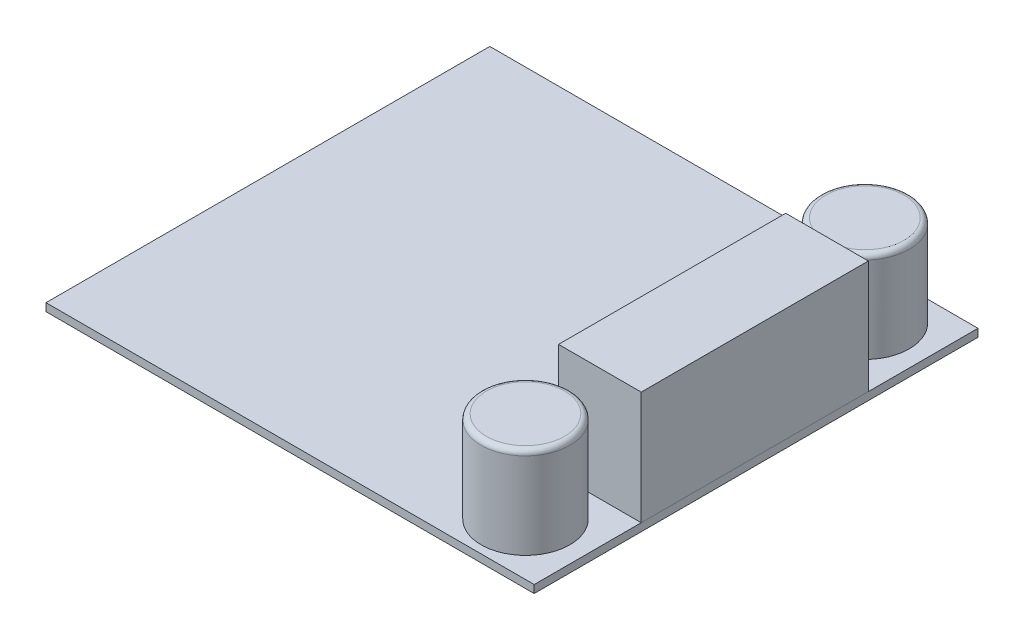
ISO-10303-21;
HEADER;
FILE_DESCRIPTION(('STEP AP214'),'2;1');
FILE_NAME('part.step','',(''),(''),'','','');
FILE_SCHEMA(('AUTOMOTIVE_DESIGN { 1 0 10303 214 1 1 1 1 }'));
ENDSEC;
DATA;
#1=APPLICATION_CONTEXT('core data for automotive mechanical design processes');
#2=APPLICATION_PROTOCOL_DEFINITION('international standard','automotive_design',2000,#1);
#3=PRODUCT_CONTEXT('',#1,'mechanical');
#4=PRODUCT('Part','Part','',(#3));
#5=PRODUCT_RELATED_PRODUCT_CATEGORY('part','',(#4));
#6=PRODUCT_DEFINITION_FORMATION('','',#4);
#7=PRODUCT_DEFINITION_CONTEXT('part definition',#1,'design');
#8=PRODUCT_DEFINITION('design','',#6,#7);
#9=PRODUCT_DEFINITION_SHAPE('','',#8);
#10=(LENGTH_UNIT() NAMED_UNIT(*) SI_UNIT(.MILLI.,.METRE.));
#11=(NAMED_UNIT(*) PLANE_ANGLE_UNIT() SI_UNIT($,.RADIAN.));
#12=(NAMED_UNIT(*) SI_UNIT($,.STERADIAN.) SOLID_ANGLE_UNIT());
#13=UNCERTAINTY_MEASURE_WITH_UNIT(LENGTH_MEASURE(1.E-05),#10,'distance_accuracy_value','');
#14=(GEOMETRIC_REPRESENTATION_CONTEXT(3) GLOBAL_UNCERTAINTY_ASSIGNED_CONTEXT((#13)) GLOBAL_UNIT_ASSIGNED_CONTEXT((#10,
#11,#12)) REPRESENTATION_CONTEXT('',''));
#15=CARTESIAN_POINT('',(0.,0.,0.));
#16=DIRECTION('',(0.,0.,1.));
#17=DIRECTION('',(1.,0.,0.));
#18=AXIS2_PLACEMENT_3D('',#15,#16,#17);
#19=CARTESIAN_POINT('',(18.55,13.9,-12.9));
#20=DIRECTION('',(1.,0.,0.));
#21=DIRECTION('',(0.,0.,-1.));
#22=AXIS2_PLACEMENT_3D('',#19,#20,#21);
#23=PLANE('',#22);
#24=DIRECTION('',(0.,0.,1.));
#25=VECTOR('',#24,1.);
#26=CARTESIAN_POINT('',(18.55,0.9,-12.9));
#27=LINE('',#26,#25);
#28=CARTESIAN_POINT('',(18.55,0.9,-12.9));
#29=VERTEX_POINT('',#28);
#30=CARTESIAN_POINT('',(18.55,0.9,13.2));
#31=VERTEX_POINT('',#30);
#32=EDGE_CURVE('E105',#29,#31,#27,.T.);
#33=ORIENTED_EDGE('',*,*,#32,.T.);
#34=DIRECTION('',(0.,-1.,0.));
#35=VECTOR('',#34,1.);
#36=CARTESIAN_POINT('',(18.55,13.9,13.2));
#37=LINE('',#36,#35);
#38=CARTESIAN_POINT('',(18.55,13.9,13.2));
#39=VERTEX_POINT('',#38);
#40=EDGE_CURVE('E12',#39,#31,#37,.T.);
#41=ORIENTED_EDGE('',*,*,#40,.F.);
#42=DIRECTION('',(0.,0.,1.));
#43=VECTOR('',#42,1.);
#44=CARTESIAN_POINT('',(18.55,13.9,-12.9));
#45=LINE('',#44,#43);
#46=CARTESIAN_POINT('',(18.55,13.9,-12.9));
#47=VERTEX_POINT('',#46);
#48=EDGE_CURVE('E93',#47,#39,#45,.T.);
#49=ORIENTED_EDGE('',*,*,#48,.F.);
#50=DIRECTION('',(0.,-1.,0.));
#51=VECTOR('',#50,1.);
#52=CARTESIAN_POINT('',(18.55,13.9,-12.9));
#53=LINE('',#52,#51);
#54=EDGE_CURVE('E101',#47,#29,#53,.T.);
#55=ORIENTED_EDGE('',*,*,#54,.T.);
#56=EDGE_LOOP('',(#33,#41,#49,#55));
#57=FACE_BOUND('',#56,.T.);
#58=ADVANCED_FACE('F42',(#57),#23,.F.);
#59=CARTESIAN_POINT('',(18.55,13.9,13.2));
#60=DIRECTION('',(0.,0.,-1.));
#61=DIRECTION('',(-1.,0.,0.));
#62=AXIS2_PLACEMENT_3D('',#59,#60,#61);
#63=PLANE('',#62);
#64=DIRECTION('',(1.,0.,0.));
#65=VECTOR('',#64,1.);
#66=CARTESIAN_POINT('',(18.55,0.9,13.2));
#67=LINE('',#66,#65);
#68=CARTESIAN_POINT('',(28.05,0.9,13.2));
#69=VERTEX_POINT('',#68);
#70=EDGE_CURVE('E97',#31,#69,#67,.T.);
#71=ORIENTED_EDGE('',*,*,#70,.T.);
#72=DIRECTION('',(0.,-1.,0.));
#73=VECTOR('',#72,1.);
#74=CARTESIAN_POINT('',(28.05,13.9,13.2));
#75=LINE('',#74,#73);
#76=CARTESIAN_POINT('',(28.05,13.9,13.2));
#77=VERTEX_POINT('',#76);
#78=EDGE_CURVE('E50',#77,#69,#75,.T.);
#79=ORIENTED_EDGE('',*,*,#78,.F.);
#80=DIRECTION('',(1.,0.,0.));
#81=VECTOR('',#80,1.);
#82=CARTESIAN_POINT('',(18.55,13.9,13.2));
#83=LINE('',#82,#81);
#84=EDGE_CURVE('E88',#39,#77,#83,.T.);
#85=ORIENTED_EDGE('',*,*,#84,.F.);
#86=ORIENTED_EDGE('',*,*,#40,.T.);
#87=EDGE_LOOP('',(#71,#79,#85,#86));
#88=FACE_BOUND('',#87,.T.);
#89=ADVANCED_FACE('F96',(#88),#63,.F.);
#90=CARTESIAN_POINT('',(28.05,13.9,-12.9));
#91=DIRECTION('',(-1.,0.,0.));
#92=DIRECTION('',(0.,0.,1.));
#93=AXIS2_PLACEMENT_3D('',#90,#91,#92);
#94=PLANE('',#93);
#95=DIRECTION('',(0.,0.,-1.));
#96=VECTOR('',#95,1.);
#97=CARTESIAN_POINT('',(28.05,0.9,-12.9));
#98=LINE('',#97,#96);
#99=CARTESIAN_POINT('',(28.05,0.9,-12.9));
#100=VERTEX_POINT('',#99);
#101=EDGE_CURVE('E75',#69,#100,#98,.T.);
#102=ORIENTED_EDGE('',*,*,#101,.T.);
#103=DIRECTION('',(0.,-1.,0.));
#104=VECTOR('',#103,1.);
#105=CARTESIAN_POINT('',(28.05,13.9,-12.9));
#106=LINE('',#105,#104);
#107=CARTESIAN_POINT('',(28.05,13.9,-12.9));
#108=VERTEX_POINT('',#107);
#109=EDGE_CURVE('E98',#108,#100,#106,.T.);
#110=ORIENTED_EDGE('',*,*,#109,.F.);
#111=DIRECTION('',(0.,0.,-1.));
#112=VECTOR('',#111,1.);
#113=CARTESIAN_POINT('',(28.05,13.9,-12.9));
#114=LINE('',#113,#112);
#115=EDGE_CURVE('E91',#77,#108,#114,.T.);
#116=ORIENTED_EDGE('',*,*,#115,.F.);
#117=ORIENTED_EDGE('',*,*,#78,.T.);
#118=EDGE_LOOP('',(#102,#110,#116,#117));
#119=FACE_BOUND('',#118,.T.);
#120=ADVANCED_FACE('F99',(#119),#94,.F.);
#121=CARTESIAN_POINT('',(18.55,13.9,-12.9));
#122=DIRECTION('',(0.,0.,1.));
#123=DIRECTION('',(1.,0.,0.));
#124=AXIS2_PLACEMENT_3D('',#121,#122,#123);
#125=PLANE('',#124);
#126=DIRECTION('',(-1.,0.,0.));
#127=VECTOR('',#126,1.);
#128=CARTESIAN_POINT('',(18.55,0.9,-12.9));
#129=LINE('',#128,#127);
#130=EDGE_CURVE('E81',#100,#29,#129,.T.);
#131=ORIENTED_EDGE('',*,*,#130,.T.);
#132=ORIENTED_EDGE('',*,*,#54,.F.);
#133=DIRECTION('',(-1.,0.,0.));
#134=VECTOR('',#133,1.);
#135=CARTESIAN_POINT('',(18.55,13.9,-12.9));
#136=LINE('',#135,#134);
#137=EDGE_CURVE('E58',#108,#47,#136,.T.);
#138=ORIENTED_EDGE('',*,*,#137,.F.);
#139=ORIENTED_EDGE('',*,*,#109,.T.);
#140=EDGE_LOOP('',(#131,#132,#138,#139));
#141=FACE_BOUND('',#140,.T.);
#142=ADVANCED_FACE('F112',(#141),#125,.F.);
#143=CARTESIAN_POINT('',(0.,13.9,0.));
#144=DIRECTION('',(0.,1.,0.));
#145=DIRECTION('',(0.,0.,1.));
#146=AXIS2_PLACEMENT_3D('',#143,#144,#145);
#147=PLANE('',#146);
#148=ORIENTED_EDGE('',*,*,#48,.T.);
#149=ORIENTED_EDGE('',*,*,#84,.T.);
#150=ORIENTED_EDGE('',*,*,#115,.T.);
#151=ORIENTED_EDGE('',*,*,#137,.T.);
#152=EDGE_LOOP('',(#148,#149,#150,#151));
#153=FACE_BOUND('',#152,.T.);
#154=ADVANCED_FACE('F89',(#153),#147,.T.);
#155=CARTESIAN_POINT('',(0.,0.9,0.));
#156=DIRECTION('',(0.,1.,0.));
#157=DIRECTION('',(0.,0.,1.));
#158=AXIS2_PLACEMENT_3D('',#155,#156,#157);
#159=PLANE('',#158);
#160=ORIENTED_EDGE('',*,*,#32,.F.);
#161=ORIENTED_EDGE('',*,*,#130,.F.);
#162=ORIENTED_EDGE('',*,*,#101,.F.);
#163=ORIENTED_EDGE('',*,*,#70,.F.);
#164=EDGE_LOOP('',(#160,#161,#162,#163));
#165=FACE_BOUND('',#164,.T.);
#166=ADVANCED_FACE('F115',(#165),#159,.F.);
#167=CLOSED_SHELL('',(#58,#89,#120,#142,#154,#166));
#168=MANIFOLD_SOLID_BREP('B2',#167);
#169=CARTESIAN_POINT('',(0.,0.9,0.));
#170=DIRECTION('',(0.,-1.,0.));
#171=DIRECTION('',(0.,0.,-1.));
#172=AXIS2_PLACEMENT_3D('',#169,#170,#171);
#173=PLANE('',#172);
#174=DIRECTION('',(0.,0.,-1.));
#175=VECTOR('',#174,1.);
#176=CARTESIAN_POINT('',(28.05,0.9,25.5));
#177=LINE('',#176,#175);
#178=CARTESIAN_POINT('',(28.05,0.9,25.5));
#179=VERTEX_POINT('',#178);
#180=CARTESIAN_POINT('',(28.05,0.9,-25.5));
#181=VERTEX_POINT('',#180);
#182=EDGE_CURVE('E218',#179,#181,#177,.T.);
#183=ORIENTED_EDGE('',*,*,#182,.T.);
#184=DIRECTION('',(-1.,0.,0.));
#185=VECTOR('',#184,1.);
#186=CARTESIAN_POINT('',(-28.05,0.9,-25.5));
#187=LINE('',#186,#185);
#188=CARTESIAN_POINT('',(-28.05,0.9,-25.5));
#189=VERTEX_POINT('',#188);
#190=EDGE_CURVE('E213',#181,#189,#187,.T.);
#191=ORIENTED_EDGE('',*,*,#190,.T.);
#192=DIRECTION('',(0.,0.,1.));
#193=VECTOR('',#192,1.);
#194=CARTESIAN_POINT('',(-28.05,0.9,25.5));
#195=LINE('',#194,#193);
#196=CARTESIAN_POINT('',(-28.05,0.9,25.5));
#197=VERTEX_POINT('',#196);
#198=EDGE_CURVE('E216',#189,#197,#195,.T.);
#199=ORIENTED_EDGE('',*,*,#198,.T.);
#200=DIRECTION('',(1.,0.,0.));
#201=VECTOR('',#200,1.);
#202=CARTESIAN_POINT('',(-28.05,0.9,25.5));
#203=LINE('',#202,#201);
#204=EDGE_CURVE('E182',#197,#179,#203,.T.);
#205=ORIENTED_EDGE('',*,*,#204,.T.);
#206=EDGE_LOOP('',(#183,#191,#199,#205));
#207=FACE_BOUND('',#206,.T.);
#208=CARTESIAN_POINT('',(21.05,0.9,-19.5));
#209=DIRECTION('',(0.,-1.,0.));
#210=DIRECTION('',(0.,0.,-1.));
#211=AXIS2_PLACEMENT_3D('',#208,#209,#210);
#212=CIRCLE('',#211,5.1);
#213=CARTESIAN_POINT('',(21.05,0.9,-24.6));
#214=VERTEX_POINT('',#213);
#215=EDGE_CURVE('E242',#214,#214,#212,.F.);
#216=ORIENTED_EDGE('',*,*,#215,.F.);
#217=EDGE_LOOP('',(#216));
#218=FACE_BOUND('',#217,.T.);
#219=CARTESIAN_POINT('',(21.05,0.9,19.5));
#220=DIRECTION('',(0.,-1.,0.));
#221=DIRECTION('',(0.,0.,-1.));
#222=AXIS2_PLACEMENT_3D('',#219,#220,#221);
#223=CIRCLE('',#222,5.1);
#224=CARTESIAN_POINT('',(21.05,0.9,14.4));
#225=VERTEX_POINT('',#224);
#226=EDGE_CURVE('E245',#225,#225,#223,.F.);
#227=ORIENTED_EDGE('',*,*,#226,.F.);
#228=EDGE_LOOP('',(#227));
#229=FACE_BOUND('',#228,.T.);
#230=ADVANCED_FACE('F165',(#207,#218,#229),#173,.F.);
#231=CARTESIAN_POINT('',(28.05,0.9,25.5));
#232=DIRECTION('',(-1.,0.,0.));
#233=DIRECTION('',(0.,0.,1.));
#234=AXIS2_PLACEMENT_3D('',#231,#232,#233);
#235=PLANE('',#234);
#236=DIRECTION('',(0.,0.,-1.));
#237=VECTOR('',#236,1.);
#238=CARTESIAN_POINT('',(28.05,0.,25.5));
#239=LINE('',#238,#237);
#240=CARTESIAN_POINT('',(28.05,0.,25.5));
#241=VERTEX_POINT('',#240);
#242=CARTESIAN_POINT('',(28.05,0.,-25.5));
#243=VERTEX_POINT('',#242);
#244=EDGE_CURVE('E233',#241,#243,#239,.T.);
#245=ORIENTED_EDGE('',*,*,#244,.T.);
#246=DIRECTION('',(0.,-1.,0.));
#247=VECTOR('',#246,1.);
#248=CARTESIAN_POINT('',(28.05,0.9,-25.5));
#249=LINE('',#248,#247);
#250=EDGE_CURVE('E224',#181,#243,#249,.T.);
#251=ORIENTED_EDGE('',*,*,#250,.F.);
#252=ORIENTED_EDGE('',*,*,#182,.F.);
#253=DIRECTION('',(0.,-1.,0.));
#254=VECTOR('',#253,1.);
#255=CARTESIAN_POINT('',(28.05,0.9,25.5));
#256=LINE('',#255,#254);
#257=EDGE_CURVE('E229',#179,#241,#256,.T.);
#258=ORIENTED_EDGE('',*,*,#257,.T.);
#259=EDGE_LOOP('',(#245,#251,#252,#258));
#260=FACE_BOUND('',#259,.T.);
#261=ADVANCED_FACE('F267',(#260),#235,.F.);
#262=CARTESIAN_POINT('',(-28.05,0.9,-25.5));
#263=DIRECTION('',(0.,0.,1.));
#264=DIRECTION('',(1.,0.,0.));
#265=AXIS2_PLACEMENT_3D('',#262,#263,#264);
#266=PLANE('',#265);
#267=DIRECTION('',(-1.,0.,0.));
#268=VECTOR('',#267,1.);
#269=CARTESIAN_POINT('',(-28.05,0.,-25.5));
#270=LINE('',#269,#268);
#271=CARTESIAN_POINT('',(-28.05,0.,-25.5));
#272=VERTEX_POINT('',#271);
#273=EDGE_CURVE('E223',#243,#272,#270,.T.);
#274=ORIENTED_EDGE('',*,*,#273,.T.);
#275=DIRECTION('',(0.,-1.,0.));
#276=VECTOR('',#275,1.);
#277=CARTESIAN_POINT('',(-28.05,0.9,-25.5));
#278=LINE('',#277,#276);
#279=EDGE_CURVE('E221',#189,#272,#278,.T.);
#280=ORIENTED_EDGE('',*,*,#279,.F.);
#281=ORIENTED_EDGE('',*,*,#190,.F.);
#282=ORIENTED_EDGE('',*,*,#250,.T.);
#283=EDGE_LOOP('',(#274,#280,#281,#282));
#284=FACE_BOUND('',#283,.T.);
#285=ADVANCED_FACE('F222',(#284),#266,.F.);
#286=CARTESIAN_POINT('',(-28.05,0.9,25.5));
#287=DIRECTION('',(1.,0.,0.));
#288=DIRECTION('',(0.,0.,-1.));
#289=AXIS2_PLACEMENT_3D('',#286,#287,#288);
#290=PLANE('',#289);
#291=DIRECTION('',(0.,0.,1.));
#292=VECTOR('',#291,1.);
#293=CARTESIAN_POINT('',(-28.05,0.,25.5));
#294=LINE('',#293,#292);
#295=CARTESIAN_POINT('',(-28.05,0.,25.5));
#296=VERTEX_POINT('',#295);
#297=EDGE_CURVE('E199',#272,#296,#294,.T.);
#298=ORIENTED_EDGE('',*,*,#297,.T.);
#299=DIRECTION('',(0.,-1.,0.));
#300=VECTOR('',#299,1.);
#301=CARTESIAN_POINT('',(-28.05,0.9,25.5));
#302=LINE('',#301,#300);
#303=EDGE_CURVE('E225',#197,#296,#302,.T.);
#304=ORIENTED_EDGE('',*,*,#303,.F.);
#305=ORIENTED_EDGE('',*,*,#198,.F.);
#306=ORIENTED_EDGE('',*,*,#279,.T.);
#307=EDGE_LOOP('',(#298,#304,#305,#306));
#308=FACE_BOUND('',#307,.T.);
#309=ADVANCED_FACE('F227',(#308),#290,.F.);
#310=CARTESIAN_POINT('',(-28.05,0.9,25.5));
#311=DIRECTION('',(0.,0.,-1.));
#312=DIRECTION('',(-1.,0.,0.));
#313=AXIS2_PLACEMENT_3D('',#310,#311,#312);
#314=PLANE('',#313);
#315=DIRECTION('',(1.,0.,0.));
#316=VECTOR('',#315,1.);
#317=CARTESIAN_POINT('',(-28.05,0.,25.5));
#318=LINE('',#317,#316);
#319=EDGE_CURVE('E205',#296,#241,#318,.T.);
#320=ORIENTED_EDGE('',*,*,#319,.T.);
#321=ORIENTED_EDGE('',*,*,#257,.F.);
#322=ORIENTED_EDGE('',*,*,#204,.F.);
#323=ORIENTED_EDGE('',*,*,#303,.T.);
#324=EDGE_LOOP('',(#320,#321,#322,#323));
#325=FACE_BOUND('',#324,.T.);
#326=ADVANCED_FACE('F281',(#325),#314,.F.);
#327=CARTESIAN_POINT('',(0.,0.,0.));
#328=DIRECTION('',(0.,-1.,0.));
#329=DIRECTION('',(0.,0.,-1.));
#330=AXIS2_PLACEMENT_3D('',#327,#328,#329);
#331=PLANE('',#330);
#332=ORIENTED_EDGE('',*,*,#244,.F.);
#333=ORIENTED_EDGE('',*,*,#319,.F.);
#334=ORIENTED_EDGE('',*,*,#297,.F.);
#335=ORIENTED_EDGE('',*,*,#273,.F.);
#336=EDGE_LOOP('',(#332,#333,#334,#335));
#337=FACE_BOUND('',#336,.T.);
#338=ADVANCED_FACE('F278',(#337),#331,.T.);
#339=CARTESIAN_POINT('',(21.05,11.4,-19.5));
#340=DIRECTION('',(0.,-1.,0.));
#341=DIRECTION('',(0.,0.,-1.));
#342=AXIS2_PLACEMENT_3D('',#339,#340,#341);
#343=CYLINDRICAL_SURFACE('',#342,5.1);
#344=CARTESIAN_POINT('',(21.05,10.8,-19.5));
#345=DIRECTION('',(0.,1.,0.));
#346=DIRECTION('',(0.,0.,1.));
#347=AXIS2_PLACEMENT_3D('',#344,#345,#346);
#348=CIRCLE('',#347,5.1);
#349=CARTESIAN_POINT('',(21.05,10.8,-24.6));
#350=VERTEX_POINT('',#349);
#351=EDGE_CURVE('E251',#350,#350,#348,.F.);
#352=CARTESIAN_POINT('',(21.05,10.8,-24.6));
#353=CARTESIAN_POINT('',(21.05,10.696875,-24.6));
#354=CARTESIAN_POINT('',(21.05,10.59375,-24.6));
#355=CARTESIAN_POINT('',(21.05,10.3875,-24.6));
#356=CARTESIAN_POINT('',(21.05,10.284375,-24.6));
#357=CARTESIAN_POINT('',(21.05,10.078125,-24.6));
#358=CARTESIAN_POINT('',(21.05,9.975,-24.6));
#359=CARTESIAN_POINT('',(21.05,9.76875,-24.6));
#360=CARTESIAN_POINT('',(21.05,9.665625,-24.6));
#361=CARTESIAN_POINT('',(21.05,9.459375,-24.6));
#362=CARTESIAN_POINT('',(21.05,9.35625,-24.6));
#363=CARTESIAN_POINT('',(21.05,9.15,-24.6));
#364=CARTESIAN_POINT('',(21.05,9.046875,-24.6));
#365=CARTESIAN_POINT('',(21.05,8.840625,-24.6));
#366=CARTESIAN_POINT('',(21.05,8.7375,-24.6));
#367=CARTESIAN_POINT('',(21.05,8.53125,-24.6));
#368=CARTESIAN_POINT('',(21.05,8.428125,-24.6));
#369=CARTESIAN_POINT('',(21.05,8.221875,-24.6));
#370=CARTESIAN_POINT('',(21.05,8.11875,-24.6));
#371=CARTESIAN_POINT('',(21.05,7.9125,-24.6));
#372=CARTESIAN_POINT('',(21.05,7.809375,-24.6));
#373=CARTESIAN_POINT('',(21.05,7.603125,-24.6));
#374=CARTESIAN_POINT('',(21.05,7.5,-24.6));
#375=CARTESIAN_POINT('',(21.05,7.29375,-24.6));
#376=CARTESIAN_POINT('',(21.05,7.190625,-24.6));
#377=CARTESIAN_POINT('',(21.05,6.984375,-24.6));
#378=CARTESIAN_POINT('',(21.05,6.88125,-24.6));
#379=CARTESIAN_POINT('',(21.05,6.675,-24.6));
#380=CARTESIAN_POINT('',(21.05,6.571875,-24.6));
#381=CARTESIAN_POINT('',(21.05,6.365625,-24.6));
#382=CARTESIAN_POINT('',(21.05,6.2625,-24.6));
#383=CARTESIAN_POINT('',(21.05,6.05625,-24.6));
#384=CARTESIAN_POINT('',(21.05,5.953125,-24.6));
#385=CARTESIAN_POINT('',(21.05,5.746875,-24.6));
#386=CARTESIAN_POINT('',(21.05,5.64375,-24.6));
#387=CARTESIAN_POINT('',(21.05,5.4375,-24.6));
#388=CARTESIAN_POINT('',(21.05,5.334375,-24.6));
#389=CARTESIAN_POINT('',(21.05,5.128125,-24.6));
#390=CARTESIAN_POINT('',(21.05,5.025,-24.6));
#391=CARTESIAN_POINT('',(21.05,4.81875,-24.6));
#392=CARTESIAN_POINT('',(21.05,4.715625,-24.6));
#393=CARTESIAN_POINT('',(21.05,4.509375,-24.6));
#394=CARTESIAN_POINT('',(21.05,4.40625,-24.6));
#395=CARTESIAN_POINT('',(21.05,4.2,-24.6));
#396=CARTESIAN_POINT('',(21.05,4.096875,-24.6));
#397=CARTESIAN_POINT('',(21.05,3.890625,-24.6));
#398=CARTESIAN_POINT('',(21.05,3.7875,-24.6));
#399=CARTESIAN_POINT('',(21.05,3.58125,-24.6));
#400=CARTESIAN_POINT('',(21.05,3.478125,-24.6));
#401=CARTESIAN_POINT('',(21.05,3.271875,-24.6));
#402=CARTESIAN_POINT('',(21.05,3.16875,-24.6));
#403=CARTESIAN_POINT('',(21.05,2.9625,-24.6));
#404=CARTESIAN_POINT('',(21.05,2.859375,-24.6));
#405=CARTESIAN_POINT('',(21.05,2.653125,-24.6));
#406=CARTESIAN_POINT('',(21.05,2.55,-24.6));
#407=CARTESIAN_POINT('',(21.05,2.34375,-24.6));
#408=CARTESIAN_POINT('',(21.05,2.240625,-24.6));
#409=CARTESIAN_POINT('',(21.05,2.034375,-24.6));
#410=CARTESIAN_POINT('',(21.05,1.93125,-24.6));
#411=CARTESIAN_POINT('',(21.05,1.725,-24.6));
#412=CARTESIAN_POINT('',(21.05,1.621875,-24.6));
#413=CARTESIAN_POINT('',(21.05,1.415625,-24.6));
#414=CARTESIAN_POINT('',(21.05,1.3125,-24.6));
#415=CARTESIAN_POINT('',(21.05,1.10625,-24.6));
#416=CARTESIAN_POINT('',(21.05,1.003125,-24.6));
#417=CARTESIAN_POINT('',(21.05,0.9,-24.6));
#418=B_SPLINE_CURVE_WITH_KNOTS('',3,(#352,#353,#354,#355,#356,#357,#358,#359,#360,#361,#362,
#363,#364,#365,#366,#367,#368,#369,#370,#371,#372,#373,#374,#375,#376,#377,#378,#379,#380,#381,
#382,#383,#384,#385,#386,#387,#388,#389,#390,#391,#392,#393,#394,#395,#396,#397,#398,#399,#400,
#401,#402,#403,#404,#405,#406,#407,#408,#409,#410,#411,#412,#413,#414,#415,#416,#417),
.UNSPECIFIED.,.F.,.F.,(4,2,2,2,2,2,2,2,2,2,2,2,2,2,2,2,2,2,2,2,2,2,2,2,2,2,2,2,2,2,2,2,4),(0.,
0.309374999999999,0.618749999999999,0.928125,1.2375,1.546875,1.85625,2.165625,2.475,2.784375,
3.09375,3.403125,3.7125,4.021875,4.33125,4.640625,4.95,5.259375,5.56875,5.878125,6.1875,
6.496875,6.80625,7.115625,7.425,7.734375,8.04375,8.353125,8.6625,8.971875,9.28125,9.590625,9.9),.UNSPECIFIED.);
#419=EDGE_CURVE('BSEAM276',#350,#214,#418,.T.);
#420=ORIENTED_EDGE('',*,*,#351,.T.);
#421=ORIENTED_EDGE('',*,*,#215,.T.);
#422=ORIENTED_EDGE('',*,*,#419,.T.);
#423=ORIENTED_EDGE('',*,*,#419,.F.);
#424=EDGE_LOOP('',(#420,#422,#421,#423));
#425=FACE_BOUND('',#424,.T.);
#426=ADVANCED_FACE('F276',(#425),#343,.T.);
#427=CARTESIAN_POINT('',(21.05,11.4,-19.5));
#428=DIRECTION('',(0.,1.,0.));
#429=DIRECTION('',(0.,0.,1.));
#430=AXIS2_PLACEMENT_3D('',#427,#428,#429);
#431=PLANE('',#430);
#432=CARTESIAN_POINT('',(21.05,11.4,-19.5));
#433=DIRECTION('',(0.,1.,0.));
#434=DIRECTION('',(0.,0.,1.));
#435=AXIS2_PLACEMENT_3D('',#432,#433,#434);
#436=CIRCLE('',#435,4.5);
#437=CARTESIAN_POINT('',(21.05,11.4,-15.));
#438=VERTEX_POINT('',#437);
#439=EDGE_CURVE('E248',#438,#438,#436,.T.);
#440=ORIENTED_EDGE('',*,*,#439,.T.);
#441=EDGE_LOOP('',(#440));
#442=FACE_BOUND('',#441,.T.);
#443=ADVANCED_FACE('F310',(#442),#431,.T.);
#444=CARTESIAN_POINT('',(21.05,11.4,19.5));
#445=DIRECTION('',(0.,-1.,0.));
#446=DIRECTION('',(0.,0.,-1.));
#447=AXIS2_PLACEMENT_3D('',#444,#445,#446);
#448=CYLINDRICAL_SURFACE('',#447,5.1);
#449=CARTESIAN_POINT('',(21.05,10.8,19.5));
#450=DIRECTION('',(0.,-1.,0.));
#451=DIRECTION('',(0.,0.,-1.));
#452=AXIS2_PLACEMENT_3D('',#449,#450,#451);
#453=CIRCLE('',#452,5.1);
#454=CARTESIAN_POINT('',(21.05,10.8,14.4));
#455=VERTEX_POINT('',#454);
#456=EDGE_CURVE('E40',#455,#455,#453,.T.);
#457=CARTESIAN_POINT('',(21.05,10.8,14.4));
#458=CARTESIAN_POINT('',(21.05,10.696875,14.4));
#459=CARTESIAN_POINT('',(21.05,10.59375,14.4));
#460=CARTESIAN_POINT('',(21.05,10.3875,14.4));
#461=CARTESIAN_POINT('',(21.05,10.284375,14.4));
#462=CARTESIAN_POINT('',(21.05,10.078125,14.4));
#463=CARTESIAN_POINT('',(21.05,9.975,14.4));
#464=CARTESIAN_POINT('',(21.05,9.76875,14.4));
#465=CARTESIAN_POINT('',(21.05,9.665625,14.4));
#466=CARTESIAN_POINT('',(21.05,9.459375,14.4));
#467=CARTESIAN_POINT('',(21.05,9.35625,14.4));
#468=CARTESIAN_POINT('',(21.05,9.15,14.4));
#469=CARTESIAN_POINT('',(21.05,9.046875,14.4));
#470=CARTESIAN_POINT('',(21.05,8.840625,14.4));
#471=CARTESIAN_POINT('',(21.05,8.7375,14.4));
#472=CARTESIAN_POINT('',(21.05,8.53125,14.4));
#473=CARTESIAN_POINT('',(21.05,8.428125,14.4));
#474=CARTESIAN_POINT('',(21.05,8.221875,14.4));
#475=CARTESIAN_POINT('',(21.05,8.11875,14.4));
#476=CARTESIAN_POINT('',(21.05,7.9125,14.4));
#477=CARTESIAN_POINT('',(21.05,7.809375,14.4));
#478=CARTESIAN_POINT('',(21.05,7.603125,14.4));
#479=CARTESIAN_POINT('',(21.05,7.5,14.4));
#480=CARTESIAN_POINT('',(21.05,7.29375,14.4));
#481=CARTESIAN_POINT('',(21.05,7.190625,14.4));
#482=CARTESIAN_POINT('',(21.05,6.984375,14.4));
#483=CARTESIAN_POINT('',(21.05,6.88125,14.4));
#484=CARTESIAN_POINT('',(21.05,6.675,14.4));
#485=CARTESIAN_POINT('',(21.05,6.571875,14.4));
#486=CARTESIAN_POINT('',(21.05,6.365625,14.4));
#487=CARTESIAN_POINT('',(21.05,6.2625,14.4));
#488=CARTESIAN_POINT('',(21.05,6.05625,14.4));
#489=CARTESIAN_POINT('',(21.05,5.953125,14.4));
#490=CARTESIAN_POINT('',(21.05,5.746875,14.4));
#491=CARTESIAN_POINT('',(21.05,5.64375,14.4));
#492=CARTESIAN_POINT('',(21.05,5.4375,14.4));
#493=CARTESIAN_POINT('',(21.05,5.334375,14.4));
#494=CARTESIAN_POINT('',(21.05,5.128125,14.4));
#495=CARTESIAN_POINT('',(21.05,5.025,14.4));
#496=CARTESIAN_POINT('',(21.05,4.81875,14.4));
#497=CARTESIAN_POINT('',(21.05,4.715625,14.4));
#498=CARTESIAN_POINT('',(21.05,4.509375,14.4));
#499=CARTESIAN_POINT('',(21.05,4.40625,14.4));
#500=CARTESIAN_POINT('',(21.05,4.2,14.4));
#501=CARTESIAN_POINT('',(21.05,4.096875,14.4));
#502=CARTESIAN_POINT('',(21.05,3.890625,14.4));
#503=CARTESIAN_POINT('',(21.05,3.7875,14.4));
#504=CARTESIAN_POINT('',(21.05,3.58125,14.4));
#505=CARTESIAN_POINT('',(21.05,3.478125,14.4));
#506=CARTESIAN_POINT('',(21.05,3.271875,14.4));
#507=CARTESIAN_POINT('',(21.05,3.16875,14.4));
#508=CARTESIAN_POINT('',(21.05,2.9625,14.4));
#509=CARTESIAN_POINT('',(21.05,2.859375,14.4));
#510=CARTESIAN_POINT('',(21.05,2.653125,14.4));
#511=CARTESIAN_POINT('',(21.05,2.55,14.4));
#512=CARTESIAN_POINT('',(21.05,2.34375,14.4));
#513=CARTESIAN_POINT('',(21.05,2.240625,14.4));
#514=CARTESIAN_POINT('',(21.05,2.034375,14.4));
#515=CARTESIAN_POINT('',(21.05,1.93125,14.4));
#516=CARTESIAN_POINT('',(21.05,1.725,14.4));
#517=CARTESIAN_POINT('',(21.05,1.621875,14.4));
#518=CARTESIAN_POINT('',(21.05,1.415625,14.4));
#519=CARTESIAN_POINT('',(21.05,1.3125,14.4));
#520=CARTESIAN_POINT('',(21.05,1.10625,14.4));
#521=CARTESIAN_POINT('',(21.05,1.003125,14.4));
#522=CARTESIAN_POINT('',(21.05,0.9,14.4));
#523=B_SPLINE_CURVE_WITH_KNOTS('',3,(#457,#458,#459,#460,#461,#462,#463,#464,#465,#466,#467,
#468,#469,#470,#471,#472,#473,#474,#475,#476,#477,#478,#479,#480,#481,#482,#483,#484,#485,#486,
#487,#488,#489,#490,#491,#492,#493,#494,#495,#496,#497,#498,#499,#500,#501,#502,#503,#504,#505,
#506,#507,#508,#509,#510,#511,#512,#513,#514,#515,#516,#517,#518,#519,#520,#521,#522),
.UNSPECIFIED.,.F.,.F.,(4,2,2,2,2,2,2,2,2,2,2,2,2,2,2,2,2,2,2,2,2,2,2,2,2,2,2,2,2,2,2,2,4),(0.,
0.309375000000001,0.618750000000001,0.928125,1.2375,1.546875,1.85625,2.165625,2.475,2.784375,
3.09375,3.403125,3.7125,4.021875,4.33125,4.640625,4.95,5.259375,5.56875,5.878125,6.1875,
6.496875,6.80625,7.115625,7.425,7.734375,8.04375,8.353125,8.6625,8.971875,9.28125,9.590625,9.9),.UNSPECIFIED.);
#524=EDGE_CURVE('BSEAM317',#455,#225,#523,.T.);
#525=ORIENTED_EDGE('',*,*,#456,.T.);
#526=ORIENTED_EDGE('',*,*,#226,.T.);
#527=ORIENTED_EDGE('',*,*,#524,.T.);
#528=ORIENTED_EDGE('',*,*,#524,.F.);
#529=EDGE_LOOP('',(#525,#527,#526,#528));
#530=FACE_BOUND('',#529,.T.);
#531=ADVANCED_FACE('F317',(#530),#448,.T.);
#532=CARTESIAN_POINT('',(21.05,11.4,19.5));
#533=DIRECTION('',(0.,-1.,0.));
#534=DIRECTION('',(0.,0.,-1.));
#535=AXIS2_PLACEMENT_3D('',#532,#533,#534);
#536=PLANE('',#535);
#537=CARTESIAN_POINT('',(21.05,11.4,19.5));
#538=DIRECTION('',(0.,-1.,0.));
#539=DIRECTION('',(0.,0.,-1.));
#540=AXIS2_PLACEMENT_3D('',#537,#538,#539);
#541=CIRCLE('',#540,4.5);
#542=CARTESIAN_POINT('',(21.05,11.4,15.));
#543=VERTEX_POINT('',#542);
#544=EDGE_CURVE('E174',#543,#543,#541,.F.);
#545=ORIENTED_EDGE('',*,*,#544,.T.);
#546=EDGE_LOOP('',(#545));
#547=FACE_BOUND('',#546,.T.);
#548=ADVANCED_FACE('F256',(#547),#536,.F.);
#549=CARTESIAN_POINT('',(21.05,10.8,-19.5));
#550=DIRECTION('',(0.,1.,0.));
#551=DIRECTION('',(0.,0.,1.));
#552=AXIS2_PLACEMENT_3D('',#549,#550,#551);
#553=TOROIDAL_SURFACE('',#552,4.5,0.6);
#554=ORIENTED_EDGE('',*,*,#351,.F.);
#555=EDGE_LOOP('',(#554));
#556=FACE_BOUND('',#555,.T.);
#557=ORIENTED_EDGE('',*,*,#439,.F.);
#558=EDGE_LOOP('',(#557));
#559=FACE_BOUND('',#558,.T.);
#560=ADVANCED_FACE('F259',(#556,#559),#553,.T.);
#561=CARTESIAN_POINT('',(21.05,10.8,19.5));
#562=DIRECTION('',(0.,-1.,0.));
#563=DIRECTION('',(0.,0.,-1.));
#564=AXIS2_PLACEMENT_3D('',#561,#562,#563);
#565=TOROIDAL_SURFACE('',#564,4.5,0.6);
#566=ORIENTED_EDGE('',*,*,#456,.F.);
#567=EDGE_LOOP('',(#566));
#568=FACE_BOUND('',#567,.T.);
#569=ORIENTED_EDGE('',*,*,#544,.F.);
#570=EDGE_LOOP('',(#569));
#571=FACE_BOUND('',#570,.T.);
#572=ADVANCED_FACE('F167',(#568,#571),#565,.T.);
#573=CLOSED_SHELL('',(#230,#261,#285,#309,#326,#338,#426,#443,#531,#548,#560,#572));
#574=MANIFOLD_SOLID_BREP('B6',#573);
#575=ADVANCED_BREP_SHAPE_REPRESENTATION('',(#18,#168,#574),#14);
#576=SHAPE_DEFINITION_REPRESENTATION(#9,#575);
ENDSEC;
END-ISO-10303-21;
